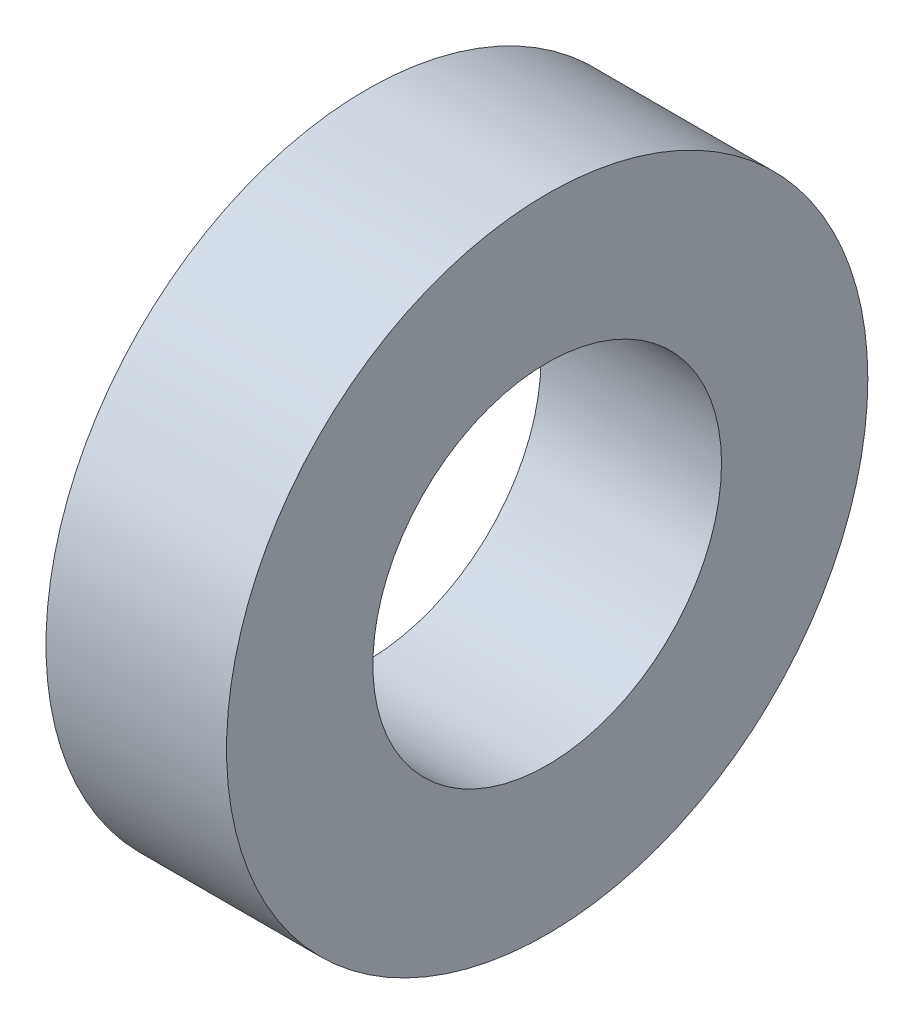
ISO-10303-21;
HEADER;
FILE_DESCRIPTION(('STEP AP214'),'2;1');
FILE_NAME('part.step','',(''),(''),'','','');
FILE_SCHEMA(('AUTOMOTIVE_DESIGN { 1 0 10303 214 1 1 1 1 }'));
ENDSEC;
DATA;
#1=APPLICATION_CONTEXT('core data for automotive mechanical design processes');
#2=APPLICATION_PROTOCOL_DEFINITION('international standard','automotive_design',2000,#1);
#3=PRODUCT_CONTEXT('',#1,'mechanical');
#4=PRODUCT('Part','Part','',(#3));
#5=PRODUCT_RELATED_PRODUCT_CATEGORY('part','',(#4));
#6=PRODUCT_DEFINITION_FORMATION('','',#4);
#7=PRODUCT_DEFINITION_CONTEXT('part definition',#1,'design');
#8=PRODUCT_DEFINITION('design','',#6,#7);
#9=PRODUCT_DEFINITION_SHAPE('','',#8);
#10=(LENGTH_UNIT() NAMED_UNIT(*) SI_UNIT(.MILLI.,.METRE.));
#11=(NAMED_UNIT(*) PLANE_ANGLE_UNIT() SI_UNIT($,.RADIAN.));
#12=(NAMED_UNIT(*) SI_UNIT($,.STERADIAN.) SOLID_ANGLE_UNIT());
#13=UNCERTAINTY_MEASURE_WITH_UNIT(LENGTH_MEASURE(1.E-05),#10,'distance_accuracy_value','');
#14=(GEOMETRIC_REPRESENTATION_CONTEXT(3) GLOBAL_UNCERTAINTY_ASSIGNED_CONTEXT((#13)) GLOBAL_UNIT_ASSIGNED_CONTEXT((#10,
#11,#12)) REPRESENTATION_CONTEXT('',''));
#15=CARTESIAN_POINT('',(0.,0.,0.));
#16=DIRECTION('',(0.,0.,1.));
#17=DIRECTION('',(1.,0.,0.));
#18=AXIS2_PLACEMENT_3D('',#15,#16,#17);
#19=CARTESIAN_POINT('',(1.4732,0.,0.));
#20=DIRECTION('',(1.,0.,0.));
#21=DIRECTION('',(0.,0.,-1.));
#22=AXIS2_PLACEMENT_3D('',#19,#20,#21);
#23=PLANE('',#22);
#24=CARTESIAN_POINT('',(1.4732,0.,0.));
#25=DIRECTION('',(1.,0.,0.));
#26=DIRECTION('',(0.,0.,-1.));
#27=AXIS2_PLACEMENT_3D('',#24,#25,#26);
#28=CIRCLE('',#27,2.6162);
#29=CARTESIAN_POINT('',(1.4732,0.,-2.6162));
#30=VERTEX_POINT('',#29);
#31=EDGE_CURVE('E10',#30,#30,#28,.T.);
#32=ORIENTED_EDGE('',*,*,#31,.T.);
#33=EDGE_LOOP('',(#32));
#34=FACE_BOUND('',#33,.T.);
#35=CARTESIAN_POINT('',(1.4732,0.,0.));
#36=DIRECTION('',(1.,0.,0.));
#37=DIRECTION('',(0.,0.,-1.));
#38=AXIS2_PLACEMENT_3D('',#35,#36,#37);
#39=CIRCLE('',#38,1.4224);
#40=CARTESIAN_POINT('',(1.4732,0.,-1.4224));
#41=VERTEX_POINT('',#40);
#42=EDGE_CURVE('E41',#41,#41,#39,.T.);
#43=ORIENTED_EDGE('',*,*,#42,.F.);
#44=EDGE_LOOP('',(#43));
#45=FACE_BOUND('',#44,.T.);
#46=ADVANCED_FACE('F30',(#34,#45),#23,.T.);
#47=CARTESIAN_POINT('',(0.,0.,0.));
#48=DIRECTION('',(1.,0.,0.));
#49=DIRECTION('',(0.,0.,-1.));
#50=AXIS2_PLACEMENT_3D('',#47,#48,#49);
#51=PLANE('',#50);
#52=CARTESIAN_POINT('',(0.,0.,0.));
#53=DIRECTION('',(1.,0.,0.));
#54=DIRECTION('',(0.,0.,-1.));
#55=AXIS2_PLACEMENT_3D('',#52,#53,#54);
#56=CIRCLE('',#55,2.6162);
#57=CARTESIAN_POINT('',(0.,0.,-2.6162));
#58=VERTEX_POINT('',#57);
#59=EDGE_CURVE('E34',#58,#58,#56,.T.);
#60=ORIENTED_EDGE('',*,*,#59,.F.);
#61=EDGE_LOOP('',(#60));
#62=FACE_BOUND('',#61,.T.);
#63=CARTESIAN_POINT('',(0.,0.,0.));
#64=DIRECTION('',(1.,0.,0.));
#65=DIRECTION('',(0.,0.,-1.));
#66=AXIS2_PLACEMENT_3D('',#63,#64,#65);
#67=CIRCLE('',#66,1.4224);
#68=CARTESIAN_POINT('',(0.,0.,-1.4224));
#69=VERTEX_POINT('',#68);
#70=EDGE_CURVE('E43',#69,#69,#67,.T.);
#71=ORIENTED_EDGE('',*,*,#70,.T.);
#72=EDGE_LOOP('',(#71));
#73=FACE_BOUND('',#72,.T.);
#74=ADVANCED_FACE('F53',(#62,#73),#51,.F.);
#75=CARTESIAN_POINT('',(1.4732,0.,0.));
#76=DIRECTION('',(-1.,0.,0.));
#77=DIRECTION('',(0.,0.,1.));
#78=AXIS2_PLACEMENT_3D('',#75,#76,#77);
#79=CYLINDRICAL_SURFACE('',#78,2.6162);
#80=ORIENTED_EDGE('',*,*,#31,.F.);
#81=EDGE_LOOP('',(#80));
#82=FACE_BOUND('',#81,.T.);
#83=ORIENTED_EDGE('',*,*,#59,.T.);
#84=EDGE_LOOP('',(#83));
#85=FACE_BOUND('',#84,.T.);
#86=ADVANCED_FACE('F32',(#82,#85),#79,.T.);
#87=CARTESIAN_POINT('',(1.4732,0.,0.));
#88=DIRECTION('',(-1.,0.,0.));
#89=DIRECTION('',(0.,0.,1.));
#90=AXIS2_PLACEMENT_3D('',#87,#88,#89);
#91=CYLINDRICAL_SURFACE('',#90,1.4224);
#92=ORIENTED_EDGE('',*,*,#42,.T.);
#93=EDGE_LOOP('',(#92));
#94=FACE_BOUND('',#93,.T.);
#95=ORIENTED_EDGE('',*,*,#70,.F.);
#96=EDGE_LOOP('',(#95));
#97=FACE_BOUND('',#96,.T.);
#98=ADVANCED_FACE('F49',(#94,#97),#91,.F.);
#99=CLOSED_SHELL('',(#46,#74,#86,#98));
#100=MANIFOLD_SOLID_BREP('B2',#99);
#101=ADVANCED_BREP_SHAPE_REPRESENTATION('',(#18,#100),#14);
#102=SHAPE_DEFINITION_REPRESENTATION(#9,#101);
ENDSEC;
END-ISO-10303-21;
